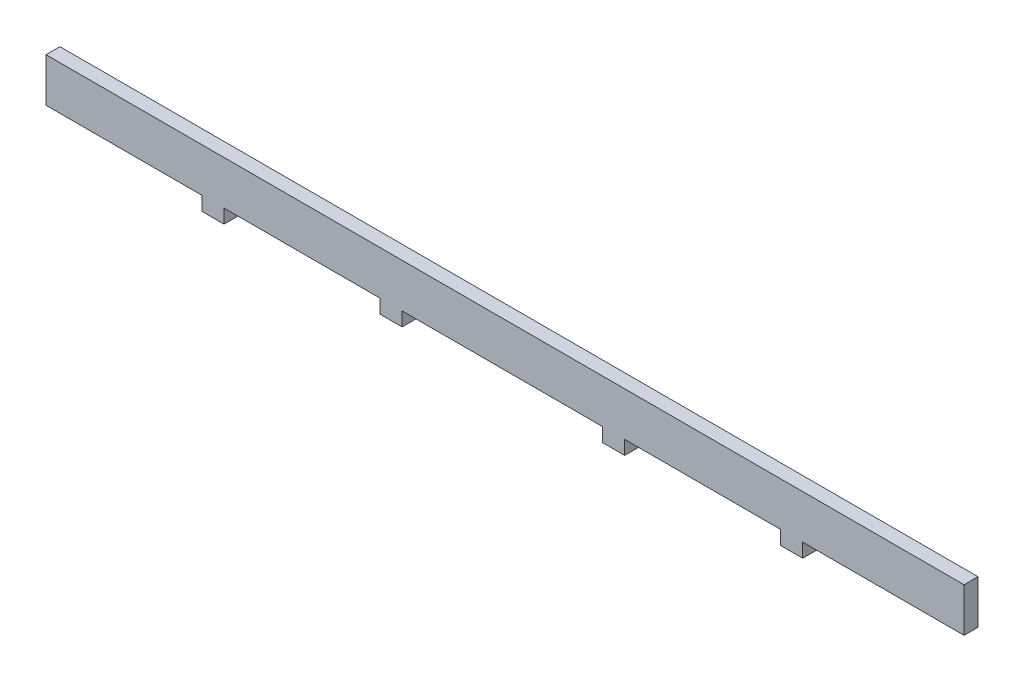
ISO-10303-21;
HEADER;
FILE_DESCRIPTION(('STEP AP214'),'2;1');
FILE_NAME('part.step','',(''),(''),'','','');
FILE_SCHEMA(('AUTOMOTIVE_DESIGN { 1 0 10303 214 1 1 1 1 }'));
ENDSEC;
DATA;
#1=APPLICATION_CONTEXT('core data for automotive mechanical design processes');
#2=APPLICATION_PROTOCOL_DEFINITION('international standard','automotive_design',2000,#1);
#3=PRODUCT_CONTEXT('',#1,'mechanical');
#4=PRODUCT('Part','Part','',(#3));
#5=PRODUCT_RELATED_PRODUCT_CATEGORY('part','',(#4));
#6=PRODUCT_DEFINITION_FORMATION('','',#4);
#7=PRODUCT_DEFINITION_CONTEXT('part definition',#1,'design');
#8=PRODUCT_DEFINITION('design','',#6,#7);
#9=PRODUCT_DEFINITION_SHAPE('','',#8);
#10=(LENGTH_UNIT() NAMED_UNIT(*) SI_UNIT(.MILLI.,.METRE.));
#11=(NAMED_UNIT(*) PLANE_ANGLE_UNIT() SI_UNIT($,.RADIAN.));
#12=(NAMED_UNIT(*) SI_UNIT($,.STERADIAN.) SOLID_ANGLE_UNIT());
#13=UNCERTAINTY_MEASURE_WITH_UNIT(LENGTH_MEASURE(1.E-05),#10,'distance_accuracy_value','');
#14=(GEOMETRIC_REPRESENTATION_CONTEXT(3) GLOBAL_UNCERTAINTY_ASSIGNED_CONTEXT((#13)) GLOBAL_UNIT_ASSIGNED_CONTEXT((#10,
#11,#12)) REPRESENTATION_CONTEXT('',''));
#15=CARTESIAN_POINT('',(0.,0.,0.));
#16=DIRECTION('',(0.,0.,1.));
#17=DIRECTION('',(1.,0.,0.));
#18=AXIS2_PLACEMENT_3D('',#15,#16,#17);
#19=CARTESIAN_POINT('',(-129.267215106676,70.106814657639,3.175));
#20=DIRECTION('',(1.,0.,0.));
#21=DIRECTION('',(0.,0.,-1.));
#22=AXIS2_PLACEMENT_3D('',#19,#20,#21);
#23=PLANE('',#22);
#24=DIRECTION('',(0.,-1.,0.));
#25=VECTOR('',#24,1.);
#26=CARTESIAN_POINT('',(-129.267215106676,70.106814657639,0.));
#27=LINE('',#26,#25);
#28=CARTESIAN_POINT('',(-129.267215106676,70.106814657639,0.));
#29=VERTEX_POINT('',#28);
#30=CARTESIAN_POINT('',(-129.267215106676,60.106814657639,0.));
#31=VERTEX_POINT('',#30);
#32=EDGE_CURVE('E201',#29,#31,#27,.T.);
#33=ORIENTED_EDGE('',*,*,#32,.T.);
#34=DIRECTION('',(0.,0.,-1.));
#35=VECTOR('',#34,1.);
#36=CARTESIAN_POINT('',(-129.267215106676,60.106814657639,3.175));
#37=LINE('',#36,#35);
#38=CARTESIAN_POINT('',(-129.267215106676,60.106814657639,3.175));
#39=VERTEX_POINT('',#38);
#40=EDGE_CURVE('E11',#39,#31,#37,.T.);
#41=ORIENTED_EDGE('',*,*,#40,.F.);
#42=DIRECTION('',(0.,-1.,0.));
#43=VECTOR('',#42,1.);
#44=CARTESIAN_POINT('',(-129.267215106676,70.106814657639,3.175));
#45=LINE('',#44,#43);
#46=CARTESIAN_POINT('',(-129.267215106676,70.106814657639,3.175));
#47=VERTEX_POINT('',#46);
#48=EDGE_CURVE('E239',#47,#39,#45,.T.);
#49=ORIENTED_EDGE('',*,*,#48,.F.);
#50=DIRECTION('',(0.,0.,-1.));
#51=VECTOR('',#50,1.);
#52=CARTESIAN_POINT('',(-129.267215106676,70.106814657639,3.175));
#53=LINE('',#52,#51);
#54=EDGE_CURVE('E197',#47,#29,#53,.T.);
#55=ORIENTED_EDGE('',*,*,#54,.T.);
#56=EDGE_LOOP('',(#33,#41,#49,#55));
#57=FACE_BOUND('',#56,.T.);
#58=ADVANCED_FACE('F33',(#57),#23,.F.);
#59=CARTESIAN_POINT('',(-129.267215106676,60.106814657639,3.175));
#60=DIRECTION('',(0.,1.,0.));
#61=DIRECTION('',(0.,0.,1.));
#62=AXIS2_PLACEMENT_3D('',#59,#60,#61);
#63=PLANE('',#62);
#64=DIRECTION('',(1.,0.,0.));
#65=VECTOR('',#64,1.);
#66=CARTESIAN_POINT('',(-129.267215106676,60.106814657639,0.));
#67=LINE('',#66,#65);
#68=CARTESIAN_POINT('',(-93.7072151066765,60.106814657639,0.));
#69=VERTEX_POINT('',#68);
#70=EDGE_CURVE('E204',#31,#69,#67,.T.);
#71=ORIENTED_EDGE('',*,*,#70,.T.);
#72=DIRECTION('',(0.,0.,-1.));
#73=VECTOR('',#72,1.);
#74=CARTESIAN_POINT('',(-93.7072151066765,60.106814657639,3.175));
#75=LINE('',#74,#73);
#76=CARTESIAN_POINT('',(-93.7072151066765,60.106814657639,3.175));
#77=VERTEX_POINT('',#76);
#78=EDGE_CURVE('E41',#77,#69,#75,.T.);
#79=ORIENTED_EDGE('',*,*,#78,.F.);
#80=DIRECTION('',(1.,0.,0.));
#81=VECTOR('',#80,1.);
#82=CARTESIAN_POINT('',(-129.267215106676,60.106814657639,3.175));
#83=LINE('',#82,#81);
#84=EDGE_CURVE('E128',#39,#77,#83,.T.);
#85=ORIENTED_EDGE('',*,*,#84,.F.);
#86=ORIENTED_EDGE('',*,*,#40,.T.);
#87=EDGE_LOOP('',(#71,#79,#85,#86));
#88=FACE_BOUND('',#87,.T.);
#89=ADVANCED_FACE('F357',(#88),#63,.F.);
#90=CARTESIAN_POINT('',(-93.7072151066765,60.106814657639,3.175));
#91=DIRECTION('',(1.,0.,0.));
#92=DIRECTION('',(0.,0.,-1.));
#93=AXIS2_PLACEMENT_3D('',#90,#91,#92);
#94=PLANE('',#93);
#95=DIRECTION('',(0.,-1.,0.));
#96=VECTOR('',#95,1.);
#97=CARTESIAN_POINT('',(-93.7072151066765,60.106814657639,0.));
#98=LINE('',#97,#96);
#99=CARTESIAN_POINT('',(-93.7072151066765,56.931814657639,0.));
#100=VERTEX_POINT('',#99);
#101=EDGE_CURVE('E206',#69,#100,#98,.T.);
#102=ORIENTED_EDGE('',*,*,#101,.T.);
#103=DIRECTION('',(0.,0.,-1.));
#104=VECTOR('',#103,1.);
#105=CARTESIAN_POINT('',(-93.7072151066765,56.931814657639,3.175));
#106=LINE('',#105,#104);
#107=CARTESIAN_POINT('',(-93.7072151066765,56.931814657639,3.175));
#108=VERTEX_POINT('',#107);
#109=EDGE_CURVE('E282',#108,#100,#106,.T.);
#110=ORIENTED_EDGE('',*,*,#109,.F.);
#111=DIRECTION('',(0.,-1.,0.));
#112=VECTOR('',#111,1.);
#113=CARTESIAN_POINT('',(-93.7072151066765,60.106814657639,3.175));
#114=LINE('',#113,#112);
#115=EDGE_CURVE('E290',#77,#108,#114,.T.);
#116=ORIENTED_EDGE('',*,*,#115,.F.);
#117=ORIENTED_EDGE('',*,*,#78,.T.);
#118=EDGE_LOOP('',(#102,#110,#116,#117));
#119=FACE_BOUND('',#118,.T.);
#120=ADVANCED_FACE('F288',(#119),#94,.F.);
#121=CARTESIAN_POINT('',(-93.7072151066765,56.931814657639,3.175));
#122=DIRECTION('',(0.,1.,0.));
#123=DIRECTION('',(0.,0.,1.));
#124=AXIS2_PLACEMENT_3D('',#121,#122,#123);
#125=PLANE('',#124);
#126=DIRECTION('',(1.,0.,0.));
#127=VECTOR('',#126,1.);
#128=CARTESIAN_POINT('',(-93.7072151066765,56.931814657639,0.));
#129=LINE('',#128,#127);
#130=CARTESIAN_POINT('',(-88.6272151066764,56.931814657639,0.));
#131=VERTEX_POINT('',#130);
#132=EDGE_CURVE('E208',#100,#131,#129,.T.);
#133=ORIENTED_EDGE('',*,*,#132,.T.);
#134=DIRECTION('',(0.,0.,-1.));
#135=VECTOR('',#134,1.);
#136=CARTESIAN_POINT('',(-88.6272151066764,56.931814657639,3.175));
#137=LINE('',#136,#135);
#138=CARTESIAN_POINT('',(-88.6272151066764,56.931814657639,3.175));
#139=VERTEX_POINT('',#138);
#140=EDGE_CURVE('E279',#139,#131,#137,.T.);
#141=ORIENTED_EDGE('',*,*,#140,.F.);
#142=DIRECTION('',(1.,0.,0.));
#143=VECTOR('',#142,1.);
#144=CARTESIAN_POINT('',(-93.7072151066765,56.931814657639,3.175));
#145=LINE('',#144,#143);
#146=EDGE_CURVE('E308',#108,#139,#145,.T.);
#147=ORIENTED_EDGE('',*,*,#146,.F.);
#148=ORIENTED_EDGE('',*,*,#109,.T.);
#149=EDGE_LOOP('',(#133,#141,#147,#148));
#150=FACE_BOUND('',#149,.T.);
#151=ADVANCED_FACE('F299',(#150),#125,.F.);
#152=CARTESIAN_POINT('',(-88.6272151066765,60.106814657639,3.175));
#153=DIRECTION('',(-1.,0.,0.));
#154=DIRECTION('',(0.,-1.,0.));
#155=AXIS2_PLACEMENT_3D('',#152,#153,#154);
#156=PLANE('',#155);
#157=DIRECTION('',(0.,1.,0.));
#158=VECTOR('',#157,1.);
#159=CARTESIAN_POINT('',(-88.6272151066765,60.106814657639,0.));
#160=LINE('',#159,#158);
#161=CARTESIAN_POINT('',(-88.6272151066765,60.106814657639,0.));
#162=VERTEX_POINT('',#161);
#163=EDGE_CURVE('E210',#131,#162,#160,.T.);
#164=ORIENTED_EDGE('',*,*,#163,.T.);
#165=DIRECTION('',(0.,0.,-1.));
#166=VECTOR('',#165,1.);
#167=CARTESIAN_POINT('',(-88.6272151066765,60.106814657639,3.175));
#168=LINE('',#167,#166);
#169=CARTESIAN_POINT('',(-88.6272151066765,60.106814657639,3.175));
#170=VERTEX_POINT('',#169);
#171=EDGE_CURVE('E276',#170,#162,#168,.T.);
#172=ORIENTED_EDGE('',*,*,#171,.F.);
#173=DIRECTION('',(0.,1.,0.));
#174=VECTOR('',#173,1.);
#175=CARTESIAN_POINT('',(-88.6272151066765,60.106814657639,3.175));
#176=LINE('',#175,#174);
#177=EDGE_CURVE('E305',#139,#170,#176,.T.);
#178=ORIENTED_EDGE('',*,*,#177,.F.);
#179=ORIENTED_EDGE('',*,*,#140,.T.);
#180=EDGE_LOOP('',(#164,#172,#178,#179));
#181=FACE_BOUND('',#180,.T.);
#182=ADVANCED_FACE('F303',(#181),#156,.F.);
#183=CARTESIAN_POINT('',(-88.6272151066765,60.106814657639,3.175));
#184=DIRECTION('',(0.,1.,0.));
#185=DIRECTION('',(0.,0.,1.));
#186=AXIS2_PLACEMENT_3D('',#183,#184,#185);
#187=PLANE('',#186);
#188=DIRECTION('',(1.,0.,0.));
#189=VECTOR('',#188,1.);
#190=CARTESIAN_POINT('',(-88.6272151066765,60.106814657639,0.));
#191=LINE('',#190,#189);
#192=CARTESIAN_POINT('',(-53.0672151066765,60.106814657639,0.));
#193=VERTEX_POINT('',#192);
#194=EDGE_CURVE('E212',#162,#193,#191,.T.);
#195=ORIENTED_EDGE('',*,*,#194,.T.);
#196=DIRECTION('',(0.,0.,-1.));
#197=VECTOR('',#196,1.);
#198=CARTESIAN_POINT('',(-53.0672151066765,60.106814657639,3.175));
#199=LINE('',#198,#197);
#200=CARTESIAN_POINT('',(-53.0672151066765,60.106814657639,3.175));
#201=VERTEX_POINT('',#200);
#202=EDGE_CURVE('E273',#201,#193,#199,.T.);
#203=ORIENTED_EDGE('',*,*,#202,.F.);
#204=DIRECTION('',(1.,0.,0.));
#205=VECTOR('',#204,1.);
#206=CARTESIAN_POINT('',(-88.6272151066765,60.106814657639,3.175));
#207=LINE('',#206,#205);
#208=EDGE_CURVE('E307',#170,#201,#207,.T.);
#209=ORIENTED_EDGE('',*,*,#208,.F.);
#210=ORIENTED_EDGE('',*,*,#171,.T.);
#211=EDGE_LOOP('',(#195,#203,#209,#210));
#212=FACE_BOUND('',#211,.T.);
#213=ADVANCED_FACE('F370',(#212),#187,.F.);
#214=CARTESIAN_POINT('',(-53.0672151066765,60.106814657639,3.175));
#215=DIRECTION('',(1.,0.,0.));
#216=DIRECTION('',(0.,0.,-1.));
#217=AXIS2_PLACEMENT_3D('',#214,#215,#216);
#218=PLANE('',#217);
#219=DIRECTION('',(0.,-1.,0.));
#220=VECTOR('',#219,1.);
#221=CARTESIAN_POINT('',(-53.0672151066765,60.106814657639,0.));
#222=LINE('',#221,#220);
#223=CARTESIAN_POINT('',(-53.0672151066765,56.931814657639,0.));
#224=VERTEX_POINT('',#223);
#225=EDGE_CURVE('E214',#193,#224,#222,.T.);
#226=ORIENTED_EDGE('',*,*,#225,.T.);
#227=DIRECTION('',(0.,0.,-1.));
#228=VECTOR('',#227,1.);
#229=CARTESIAN_POINT('',(-53.0672151066765,56.931814657639,3.175));
#230=LINE('',#229,#228);
#231=CARTESIAN_POINT('',(-53.0672151066765,56.931814657639,3.175));
#232=VERTEX_POINT('',#231);
#233=EDGE_CURVE('E270',#232,#224,#230,.T.);
#234=ORIENTED_EDGE('',*,*,#233,.F.);
#235=DIRECTION('',(0.,-1.,0.));
#236=VECTOR('',#235,1.);
#237=CARTESIAN_POINT('',(-53.0672151066765,60.106814657639,3.175));
#238=LINE('',#237,#236);
#239=EDGE_CURVE('E310',#201,#232,#238,.T.);
#240=ORIENTED_EDGE('',*,*,#239,.F.);
#241=ORIENTED_EDGE('',*,*,#202,.T.);
#242=EDGE_LOOP('',(#226,#234,#240,#241));
#243=FACE_BOUND('',#242,.T.);
#244=ADVANCED_FACE('F373',(#243),#218,.F.);
#245=CARTESIAN_POINT('',(-53.0672151066765,56.931814657639,3.175));
#246=DIRECTION('',(0.,1.,0.));
#247=DIRECTION('',(0.,0.,1.));
#248=AXIS2_PLACEMENT_3D('',#245,#246,#247);
#249=PLANE('',#248);
#250=DIRECTION('',(1.,0.,0.));
#251=VECTOR('',#250,1.);
#252=CARTESIAN_POINT('',(-53.0672151066765,56.931814657639,0.));
#253=LINE('',#252,#251);
#254=CARTESIAN_POINT('',(-47.9872151066765,56.931814657639,0.));
#255=VERTEX_POINT('',#254);
#256=EDGE_CURVE('E216',#224,#255,#253,.T.);
#257=ORIENTED_EDGE('',*,*,#256,.T.);
#258=DIRECTION('',(0.,0.,-1.));
#259=VECTOR('',#258,1.);
#260=CARTESIAN_POINT('',(-47.9872151066765,56.931814657639,3.175));
#261=LINE('',#260,#259);
#262=CARTESIAN_POINT('',(-47.9872151066765,56.931814657639,3.175));
#263=VERTEX_POINT('',#262);
#264=EDGE_CURVE('E267',#263,#255,#261,.T.);
#265=ORIENTED_EDGE('',*,*,#264,.F.);
#266=DIRECTION('',(1.,0.,0.));
#267=VECTOR('',#266,1.);
#268=CARTESIAN_POINT('',(-53.0672151066765,56.931814657639,3.175));
#269=LINE('',#268,#267);
#270=EDGE_CURVE('E316',#232,#263,#269,.T.);
#271=ORIENTED_EDGE('',*,*,#270,.F.);
#272=ORIENTED_EDGE('',*,*,#233,.T.);
#273=EDGE_LOOP('',(#257,#265,#271,#272));
#274=FACE_BOUND('',#273,.T.);
#275=ADVANCED_FACE('F377',(#274),#249,.F.);
#276=CARTESIAN_POINT('',(-47.9872151066765,60.106814657639,3.175));
#277=DIRECTION('',(-1.,0.,0.));
#278=DIRECTION('',(0.,0.,1.));
#279=AXIS2_PLACEMENT_3D('',#276,#277,#278);
#280=PLANE('',#279);
#281=DIRECTION('',(0.,1.,0.));
#282=VECTOR('',#281,1.);
#283=CARTESIAN_POINT('',(-47.9872151066765,60.106814657639,0.));
#284=LINE('',#283,#282);
#285=CARTESIAN_POINT('',(-47.9872151066765,60.106814657639,0.));
#286=VERTEX_POINT('',#285);
#287=EDGE_CURVE('E218',#255,#286,#284,.T.);
#288=ORIENTED_EDGE('',*,*,#287,.T.);
#289=DIRECTION('',(0.,0.,-1.));
#290=VECTOR('',#289,1.);
#291=CARTESIAN_POINT('',(-47.9872151066765,60.106814657639,3.175));
#292=LINE('',#291,#290);
#293=CARTESIAN_POINT('',(-47.9872151066765,60.106814657639,3.175));
#294=VERTEX_POINT('',#293);
#295=EDGE_CURVE('E264',#294,#286,#292,.T.);
#296=ORIENTED_EDGE('',*,*,#295,.F.);
#297=DIRECTION('',(0.,1.,0.));
#298=VECTOR('',#297,1.);
#299=CARTESIAN_POINT('',(-47.9872151066765,60.106814657639,3.175));
#300=LINE('',#299,#298);
#301=EDGE_CURVE('E318',#263,#294,#300,.T.);
#302=ORIENTED_EDGE('',*,*,#301,.F.);
#303=ORIENTED_EDGE('',*,*,#264,.T.);
#304=EDGE_LOOP('',(#288,#296,#302,#303));
#305=FACE_BOUND('',#304,.T.);
#306=ADVANCED_FACE('F381',(#305),#280,.F.);
#307=CARTESIAN_POINT('',(-47.9872151066765,60.106814657639,3.175));
#308=DIRECTION('',(0.,1.,0.));
#309=DIRECTION('',(0.,0.,1.));
#310=AXIS2_PLACEMENT_3D('',#307,#308,#309);
#311=PLANE('',#310);
#312=DIRECTION('',(1.,0.,0.));
#313=VECTOR('',#312,1.);
#314=CARTESIAN_POINT('',(-47.9872151066765,60.106814657639,0.));
#315=LINE('',#314,#313);
#316=CARTESIAN_POINT('',(-2.26721510667646,60.106814657639,0.));
#317=VERTEX_POINT('',#316);
#318=EDGE_CURVE('E220',#286,#317,#315,.T.);
#319=ORIENTED_EDGE('',*,*,#318,.T.);
#320=DIRECTION('',(0.,0.,-1.));
#321=VECTOR('',#320,1.);
#322=CARTESIAN_POINT('',(-2.26721510667646,60.106814657639,3.175));
#323=LINE('',#322,#321);
#324=CARTESIAN_POINT('',(-2.26721510667646,60.106814657639,3.175));
#325=VERTEX_POINT('',#324);
#326=EDGE_CURVE('E261',#325,#317,#323,.T.);
#327=ORIENTED_EDGE('',*,*,#326,.F.);
#328=DIRECTION('',(1.,0.,0.));
#329=VECTOR('',#328,1.);
#330=CARTESIAN_POINT('',(-47.9872151066765,60.106814657639,3.175));
#331=LINE('',#330,#329);
#332=EDGE_CURVE('E320',#294,#325,#331,.T.);
#333=ORIENTED_EDGE('',*,*,#332,.F.);
#334=ORIENTED_EDGE('',*,*,#295,.T.);
#335=EDGE_LOOP('',(#319,#327,#333,#334));
#336=FACE_BOUND('',#335,.T.);
#337=ADVANCED_FACE('F385',(#336),#311,.F.);
#338=CARTESIAN_POINT('',(-2.26721510667646,60.106814657639,3.175));
#339=DIRECTION('',(1.,0.,0.));
#340=DIRECTION('',(0.,0.,-1.));
#341=AXIS2_PLACEMENT_3D('',#338,#339,#340);
#342=PLANE('',#341);
#343=DIRECTION('',(0.,-1.,0.));
#344=VECTOR('',#343,1.);
#345=CARTESIAN_POINT('',(-2.26721510667646,60.106814657639,0.));
#346=LINE('',#345,#344);
#347=CARTESIAN_POINT('',(-2.26721510667646,56.931814657639,0.));
#348=VERTEX_POINT('',#347);
#349=EDGE_CURVE('E222',#317,#348,#346,.T.);
#350=ORIENTED_EDGE('',*,*,#349,.T.);
#351=DIRECTION('',(0.,0.,-1.));
#352=VECTOR('',#351,1.);
#353=CARTESIAN_POINT('',(-2.26721510667646,56.931814657639,3.175));
#354=LINE('',#353,#352);
#355=CARTESIAN_POINT('',(-2.26721510667646,56.931814657639,3.175));
#356=VERTEX_POINT('',#355);
#357=EDGE_CURVE('E258',#356,#348,#354,.T.);
#358=ORIENTED_EDGE('',*,*,#357,.F.);
#359=DIRECTION('',(0.,-1.,0.));
#360=VECTOR('',#359,1.);
#361=CARTESIAN_POINT('',(-2.26721510667646,60.106814657639,3.175));
#362=LINE('',#361,#360);
#363=EDGE_CURVE('E322',#325,#356,#362,.T.);
#364=ORIENTED_EDGE('',*,*,#363,.F.);
#365=ORIENTED_EDGE('',*,*,#326,.T.);
#366=EDGE_LOOP('',(#350,#358,#364,#365));
#367=FACE_BOUND('',#366,.T.);
#368=ADVANCED_FACE('F389',(#367),#342,.F.);
#369=CARTESIAN_POINT('',(-2.26721510667646,56.931814657639,3.175));
#370=DIRECTION('',(0.,1.,0.));
#371=DIRECTION('',(0.,0.,1.));
#372=AXIS2_PLACEMENT_3D('',#369,#370,#371);
#373=PLANE('',#372);
#374=DIRECTION('',(1.,0.,0.));
#375=VECTOR('',#374,1.);
#376=CARTESIAN_POINT('',(-2.26721510667646,56.931814657639,0.));
#377=LINE('',#376,#375);
#378=CARTESIAN_POINT('',(2.81278489332355,56.931814657639,0.));
#379=VERTEX_POINT('',#378);
#380=EDGE_CURVE('E224',#348,#379,#377,.T.);
#381=ORIENTED_EDGE('',*,*,#380,.T.);
#382=DIRECTION('',(0.,0.,-1.));
#383=VECTOR('',#382,1.);
#384=CARTESIAN_POINT('',(2.81278489332355,56.931814657639,3.175));
#385=LINE('',#384,#383);
#386=CARTESIAN_POINT('',(2.81278489332355,56.931814657639,3.175));
#387=VERTEX_POINT('',#386);
#388=EDGE_CURVE('E255',#387,#379,#385,.T.);
#389=ORIENTED_EDGE('',*,*,#388,.F.);
#390=DIRECTION('',(1.,0.,0.));
#391=VECTOR('',#390,1.);
#392=CARTESIAN_POINT('',(-2.26721510667646,56.931814657639,3.175));
#393=LINE('',#392,#391);
#394=EDGE_CURVE('E324',#356,#387,#393,.T.);
#395=ORIENTED_EDGE('',*,*,#394,.F.);
#396=ORIENTED_EDGE('',*,*,#357,.T.);
#397=EDGE_LOOP('',(#381,#389,#395,#396));
#398=FACE_BOUND('',#397,.T.);
#399=ADVANCED_FACE('F393',(#398),#373,.F.);
#400=CARTESIAN_POINT('',(2.81278489332354,60.106814657639,3.175));
#401=DIRECTION('',(-1.,0.,0.));
#402=DIRECTION('',(0.,-1.,0.));
#403=AXIS2_PLACEMENT_3D('',#400,#401,#402);
#404=PLANE('',#403);
#405=DIRECTION('',(0.,1.,0.));
#406=VECTOR('',#405,1.);
#407=CARTESIAN_POINT('',(2.81278489332354,60.106814657639,0.));
#408=LINE('',#407,#406);
#409=CARTESIAN_POINT('',(2.81278489332354,60.106814657639,0.));
#410=VERTEX_POINT('',#409);
#411=EDGE_CURVE('E226',#379,#410,#408,.T.);
#412=ORIENTED_EDGE('',*,*,#411,.T.);
#413=DIRECTION('',(0.,0.,-1.));
#414=VECTOR('',#413,1.);
#415=CARTESIAN_POINT('',(2.81278489332354,60.106814657639,3.175));
#416=LINE('',#415,#414);
#417=CARTESIAN_POINT('',(2.81278489332354,60.106814657639,3.175));
#418=VERTEX_POINT('',#417);
#419=EDGE_CURVE('E252',#418,#410,#416,.T.);
#420=ORIENTED_EDGE('',*,*,#419,.F.);
#421=DIRECTION('',(0.,1.,0.));
#422=VECTOR('',#421,1.);
#423=CARTESIAN_POINT('',(2.81278489332354,60.106814657639,3.175));
#424=LINE('',#423,#422);
#425=EDGE_CURVE('E326',#387,#418,#424,.T.);
#426=ORIENTED_EDGE('',*,*,#425,.F.);
#427=ORIENTED_EDGE('',*,*,#388,.T.);
#428=EDGE_LOOP('',(#412,#420,#426,#427));
#429=FACE_BOUND('',#428,.T.);
#430=ADVANCED_FACE('F397',(#429),#404,.F.);
#431=CARTESIAN_POINT('',(2.81278489332354,60.106814657639,3.175));
#432=DIRECTION('',(0.,1.,0.));
#433=DIRECTION('',(0.,0.,1.));
#434=AXIS2_PLACEMENT_3D('',#431,#432,#433);
#435=PLANE('',#434);
#436=DIRECTION('',(1.,0.,0.));
#437=VECTOR('',#436,1.);
#438=CARTESIAN_POINT('',(2.81278489332354,60.106814657639,0.));
#439=LINE('',#438,#437);
#440=CARTESIAN_POINT('',(38.3727848933235,60.106814657639,0.));
#441=VERTEX_POINT('',#440);
#442=EDGE_CURVE('E228',#410,#441,#439,.T.);
#443=ORIENTED_EDGE('',*,*,#442,.T.);
#444=DIRECTION('',(0.,0.,-1.));
#445=VECTOR('',#444,1.);
#446=CARTESIAN_POINT('',(38.3727848933235,60.106814657639,3.175));
#447=LINE('',#446,#445);
#448=CARTESIAN_POINT('',(38.3727848933235,60.106814657639,3.175));
#449=VERTEX_POINT('',#448);
#450=EDGE_CURVE('E249',#449,#441,#447,.T.);
#451=ORIENTED_EDGE('',*,*,#450,.F.);
#452=DIRECTION('',(1.,0.,0.));
#453=VECTOR('',#452,1.);
#454=CARTESIAN_POINT('',(2.81278489332354,60.106814657639,3.175));
#455=LINE('',#454,#453);
#456=EDGE_CURVE('E328',#418,#449,#455,.T.);
#457=ORIENTED_EDGE('',*,*,#456,.F.);
#458=ORIENTED_EDGE('',*,*,#419,.T.);
#459=EDGE_LOOP('',(#443,#451,#457,#458));
#460=FACE_BOUND('',#459,.T.);
#461=ADVANCED_FACE('F401',(#460),#435,.F.);
#462=CARTESIAN_POINT('',(38.3727848933235,60.106814657639,3.175));
#463=DIRECTION('',(1.,0.,0.));
#464=DIRECTION('',(0.,0.,-1.));
#465=AXIS2_PLACEMENT_3D('',#462,#463,#464);
#466=PLANE('',#465);
#467=DIRECTION('',(0.,-1.,0.));
#468=VECTOR('',#467,1.);
#469=CARTESIAN_POINT('',(38.3727848933235,60.106814657639,0.));
#470=LINE('',#469,#468);
#471=CARTESIAN_POINT('',(38.3727848933235,56.931814657639,0.));
#472=VERTEX_POINT('',#471);
#473=EDGE_CURVE('E230',#441,#472,#470,.T.);
#474=ORIENTED_EDGE('',*,*,#473,.T.);
#475=DIRECTION('',(0.,0.,-1.));
#476=VECTOR('',#475,1.);
#477=CARTESIAN_POINT('',(38.3727848933235,56.931814657639,3.175));
#478=LINE('',#477,#476);
#479=CARTESIAN_POINT('',(38.3727848933235,56.931814657639,3.175));
#480=VERTEX_POINT('',#479);
#481=EDGE_CURVE('E246',#480,#472,#478,.T.);
#482=ORIENTED_EDGE('',*,*,#481,.F.);
#483=DIRECTION('',(0.,-1.,0.));
#484=VECTOR('',#483,1.);
#485=CARTESIAN_POINT('',(38.3727848933235,60.106814657639,3.175));
#486=LINE('',#485,#484);
#487=EDGE_CURVE('E330',#449,#480,#486,.T.);
#488=ORIENTED_EDGE('',*,*,#487,.F.);
#489=ORIENTED_EDGE('',*,*,#450,.T.);
#490=EDGE_LOOP('',(#474,#482,#488,#489));
#491=FACE_BOUND('',#490,.T.);
#492=ADVANCED_FACE('F405',(#491),#466,.F.);
#493=CARTESIAN_POINT('',(38.3727848933235,56.931814657639,3.175));
#494=DIRECTION('',(0.,1.,0.));
#495=DIRECTION('',(0.,0.,1.));
#496=AXIS2_PLACEMENT_3D('',#493,#494,#495);
#497=PLANE('',#496);
#498=DIRECTION('',(1.,0.,0.));
#499=VECTOR('',#498,1.);
#500=CARTESIAN_POINT('',(38.3727848933235,56.931814657639,0.));
#501=LINE('',#500,#499);
#502=CARTESIAN_POINT('',(43.4527848933235,56.931814657639,0.));
#503=VERTEX_POINT('',#502);
#504=EDGE_CURVE('E232',#472,#503,#501,.T.);
#505=ORIENTED_EDGE('',*,*,#504,.T.);
#506=DIRECTION('',(0.,0.,-1.));
#507=VECTOR('',#506,1.);
#508=CARTESIAN_POINT('',(43.4527848933235,56.931814657639,3.175));
#509=LINE('',#508,#507);
#510=CARTESIAN_POINT('',(43.4527848933235,56.931814657639,3.175));
#511=VERTEX_POINT('',#510);
#512=EDGE_CURVE('E243',#511,#503,#509,.T.);
#513=ORIENTED_EDGE('',*,*,#512,.F.);
#514=DIRECTION('',(1.,0.,0.));
#515=VECTOR('',#514,1.);
#516=CARTESIAN_POINT('',(38.3727848933235,56.931814657639,3.175));
#517=LINE('',#516,#515);
#518=EDGE_CURVE('E332',#480,#511,#517,.T.);
#519=ORIENTED_EDGE('',*,*,#518,.F.);
#520=ORIENTED_EDGE('',*,*,#481,.T.);
#521=EDGE_LOOP('',(#505,#513,#519,#520));
#522=FACE_BOUND('',#521,.T.);
#523=ADVANCED_FACE('F338',(#522),#497,.F.);
#524=CARTESIAN_POINT('',(43.4527848933235,60.106814657639,3.175));
#525=DIRECTION('',(-1.,0.,0.));
#526=DIRECTION('',(0.,0.,1.));
#527=AXIS2_PLACEMENT_3D('',#524,#525,#526);
#528=PLANE('',#527);
#529=DIRECTION('',(0.,1.,0.));
#530=VECTOR('',#529,1.);
#531=CARTESIAN_POINT('',(43.4527848933235,60.106814657639,0.));
#532=LINE('',#531,#530);
#533=CARTESIAN_POINT('',(43.4527848933235,60.106814657639,0.));
#534=VERTEX_POINT('',#533);
#535=EDGE_CURVE('E234',#503,#534,#532,.T.);
#536=ORIENTED_EDGE('',*,*,#535,.T.);
#537=DIRECTION('',(0.,0.,-1.));
#538=VECTOR('',#537,1.);
#539=CARTESIAN_POINT('',(43.4527848933235,60.106814657639,3.175));
#540=LINE('',#539,#538);
#541=CARTESIAN_POINT('',(43.4527848933235,60.106814657639,3.175));
#542=VERTEX_POINT('',#541);
#543=EDGE_CURVE('E192',#542,#534,#540,.T.);
#544=ORIENTED_EDGE('',*,*,#543,.F.);
#545=DIRECTION('',(0.,1.,0.));
#546=VECTOR('',#545,1.);
#547=CARTESIAN_POINT('',(43.4527848933235,60.106814657639,3.175));
#548=LINE('',#547,#546);
#549=EDGE_CURVE('E183',#511,#542,#548,.T.);
#550=ORIENTED_EDGE('',*,*,#549,.F.);
#551=ORIENTED_EDGE('',*,*,#512,.T.);
#552=EDGE_LOOP('',(#536,#544,#550,#551));
#553=FACE_BOUND('',#552,.T.);
#554=ADVANCED_FACE('F342',(#553),#528,.F.);
#555=CARTESIAN_POINT('',(43.4527848933235,60.106814657639,3.175));
#556=DIRECTION('',(0.,1.,0.));
#557=DIRECTION('',(-1.,0.,0.));
#558=AXIS2_PLACEMENT_3D('',#555,#556,#557);
#559=PLANE('',#558);
#560=DIRECTION('',(1.,0.,0.));
#561=VECTOR('',#560,1.);
#562=CARTESIAN_POINT('',(43.4527848933235,60.106814657639,0.));
#563=LINE('',#562,#561);
#564=CARTESIAN_POINT('',(80.2827848933236,60.106814657639,0.));
#565=VERTEX_POINT('',#564);
#566=EDGE_CURVE('E191',#534,#565,#563,.T.);
#567=ORIENTED_EDGE('',*,*,#566,.T.);
#568=DIRECTION('',(0.,0.,-1.));
#569=VECTOR('',#568,1.);
#570=CARTESIAN_POINT('',(80.2827848933236,60.106814657639,3.175));
#571=LINE('',#570,#569);
#572=CARTESIAN_POINT('',(80.2827848933236,60.106814657639,3.175));
#573=VERTEX_POINT('',#572);
#574=EDGE_CURVE('E188',#573,#565,#571,.T.);
#575=ORIENTED_EDGE('',*,*,#574,.F.);
#576=DIRECTION('',(1.,0.,0.));
#577=VECTOR('',#576,1.);
#578=CARTESIAN_POINT('',(43.4527848933235,60.106814657639,3.175));
#579=LINE('',#578,#577);
#580=EDGE_CURVE('E177',#542,#573,#579,.T.);
#581=ORIENTED_EDGE('',*,*,#580,.F.);
#582=ORIENTED_EDGE('',*,*,#543,.T.);
#583=EDGE_LOOP('',(#567,#575,#581,#582));
#584=FACE_BOUND('',#583,.T.);
#585=ADVANCED_FACE('F189',(#584),#559,.F.);
#586=CARTESIAN_POINT('',(80.2827848933236,70.106814657639,3.175));
#587=DIRECTION('',(-1.,0.,0.));
#588=DIRECTION('',(0.,0.,1.));
#589=AXIS2_PLACEMENT_3D('',#586,#587,#588);
#590=PLANE('',#589);
#591=DIRECTION('',(0.,1.,0.));
#592=VECTOR('',#591,1.);
#593=CARTESIAN_POINT('',(80.2827848933236,70.106814657639,0.));
#594=LINE('',#593,#592);
#595=CARTESIAN_POINT('',(80.2827848933236,70.106814657639,0.));
#596=VERTEX_POINT('',#595);
#597=EDGE_CURVE('E114',#565,#596,#594,.T.);
#598=ORIENTED_EDGE('',*,*,#597,.T.);
#599=DIRECTION('',(0.,0.,-1.));
#600=VECTOR('',#599,1.);
#601=CARTESIAN_POINT('',(80.2827848933236,70.106814657639,3.175));
#602=LINE('',#601,#600);
#603=CARTESIAN_POINT('',(80.2827848933236,70.106814657639,3.175));
#604=VERTEX_POINT('',#603);
#605=EDGE_CURVE('E193',#604,#596,#602,.T.);
#606=ORIENTED_EDGE('',*,*,#605,.F.);
#607=DIRECTION('',(0.,1.,0.));
#608=VECTOR('',#607,1.);
#609=CARTESIAN_POINT('',(80.2827848933236,70.106814657639,3.175));
#610=LINE('',#609,#608);
#611=EDGE_CURVE('E181',#573,#604,#610,.T.);
#612=ORIENTED_EDGE('',*,*,#611,.F.);
#613=ORIENTED_EDGE('',*,*,#574,.T.);
#614=EDGE_LOOP('',(#598,#606,#612,#613));
#615=FACE_BOUND('',#614,.T.);
#616=ADVANCED_FACE('F195',(#615),#590,.F.);
#617=CARTESIAN_POINT('',(-129.267215106676,70.106814657639,3.175));
#618=DIRECTION('',(0.,-1.,0.));
#619=DIRECTION('',(0.,0.,-1.));
#620=AXIS2_PLACEMENT_3D('',#617,#618,#619);
#621=PLANE('',#620);
#622=DIRECTION('',(-1.,0.,0.));
#623=VECTOR('',#622,1.);
#624=CARTESIAN_POINT('',(-129.267215106676,70.106814657639,0.));
#625=LINE('',#624,#623);
#626=EDGE_CURVE('E120',#596,#29,#625,.T.);
#627=ORIENTED_EDGE('',*,*,#626,.T.);
#628=ORIENTED_EDGE('',*,*,#54,.F.);
#629=DIRECTION('',(-1.,0.,0.));
#630=VECTOR('',#629,1.);
#631=CARTESIAN_POINT('',(-129.267215106676,70.106814657639,3.175));
#632=LINE('',#631,#630);
#633=EDGE_CURVE('E49',#604,#47,#632,.T.);
#634=ORIENTED_EDGE('',*,*,#633,.F.);
#635=ORIENTED_EDGE('',*,*,#605,.T.);
#636=EDGE_LOOP('',(#627,#628,#634,#635));
#637=FACE_BOUND('',#636,.T.);
#638=ADVANCED_FACE('F346',(#637),#621,.F.);
#639=CARTESIAN_POINT('',(0.,0.,3.175));
#640=DIRECTION('',(0.,0.,1.));
#641=DIRECTION('',(1.,0.,0.));
#642=AXIS2_PLACEMENT_3D('',#639,#640,#641);
#643=PLANE('',#642);
#644=ORIENTED_EDGE('',*,*,#48,.T.);
#645=ORIENTED_EDGE('',*,*,#84,.T.);
#646=ORIENTED_EDGE('',*,*,#115,.T.);
#647=ORIENTED_EDGE('',*,*,#146,.T.);
#648=ORIENTED_EDGE('',*,*,#177,.T.);
#649=ORIENTED_EDGE('',*,*,#208,.T.);
#650=ORIENTED_EDGE('',*,*,#239,.T.);
#651=ORIENTED_EDGE('',*,*,#270,.T.);
#652=ORIENTED_EDGE('',*,*,#301,.T.);
#653=ORIENTED_EDGE('',*,*,#332,.T.);
#654=ORIENTED_EDGE('',*,*,#363,.T.);
#655=ORIENTED_EDGE('',*,*,#394,.T.);
#656=ORIENTED_EDGE('',*,*,#425,.T.);
#657=ORIENTED_EDGE('',*,*,#456,.T.);
#658=ORIENTED_EDGE('',*,*,#487,.T.);
#659=ORIENTED_EDGE('',*,*,#518,.T.);
#660=ORIENTED_EDGE('',*,*,#549,.T.);
#661=ORIENTED_EDGE('',*,*,#580,.T.);
#662=ORIENTED_EDGE('',*,*,#611,.T.);
#663=ORIENTED_EDGE('',*,*,#633,.T.);
#664=EDGE_LOOP('',(#644,#645,#646,#647,#648,#649,#650,#651,#652,#653,#654,#655,#656,#657,#658,
#659,#660,#661,#662,#663));
#665=FACE_BOUND('',#664,.T.);
#666=ADVANCED_FACE('F179',(#665),#643,.T.);
#667=CARTESIAN_POINT('',(0.,0.,0.));
#668=DIRECTION('',(0.,0.,1.));
#669=DIRECTION('',(1.,0.,0.));
#670=AXIS2_PLACEMENT_3D('',#667,#668,#669);
#671=PLANE('',#670);
#672=ORIENTED_EDGE('',*,*,#32,.F.);
#673=ORIENTED_EDGE('',*,*,#626,.F.);
#674=ORIENTED_EDGE('',*,*,#597,.F.);
#675=ORIENTED_EDGE('',*,*,#566,.F.);
#676=ORIENTED_EDGE('',*,*,#535,.F.);
#677=ORIENTED_EDGE('',*,*,#504,.F.);
#678=ORIENTED_EDGE('',*,*,#473,.F.);
#679=ORIENTED_EDGE('',*,*,#442,.F.);
#680=ORIENTED_EDGE('',*,*,#411,.F.);
#681=ORIENTED_EDGE('',*,*,#380,.F.);
#682=ORIENTED_EDGE('',*,*,#349,.F.);
#683=ORIENTED_EDGE('',*,*,#318,.F.);
#684=ORIENTED_EDGE('',*,*,#287,.F.);
#685=ORIENTED_EDGE('',*,*,#256,.F.);
#686=ORIENTED_EDGE('',*,*,#225,.F.);
#687=ORIENTED_EDGE('',*,*,#194,.F.);
#688=ORIENTED_EDGE('',*,*,#163,.F.);
#689=ORIENTED_EDGE('',*,*,#132,.F.);
#690=ORIENTED_EDGE('',*,*,#101,.F.);
#691=ORIENTED_EDGE('',*,*,#70,.F.);
#692=EDGE_LOOP('',(#672,#673,#674,#675,#676,#677,#678,#679,#680,#681,#682,#683,#684,#685,#686,
#687,#688,#689,#690,#691));
#693=FACE_BOUND('',#692,.T.);
#694=ADVANCED_FACE('F294',(#693),#671,.F.);
#695=CLOSED_SHELL('',(#58,#89,#120,#151,#182,#213,#244,#275,#306,#337,#368,#399,#430,#461,#492,
#523,#554,#585,#616,#638,#666,#694));
#696=MANIFOLD_SOLID_BREP('B2',#695);
#697=ADVANCED_BREP_SHAPE_REPRESENTATION('',(#18,#696),#14);
#698=SHAPE_DEFINITION_REPRESENTATION(#9,#697);
ENDSEC;
END-ISO-10303-21;
